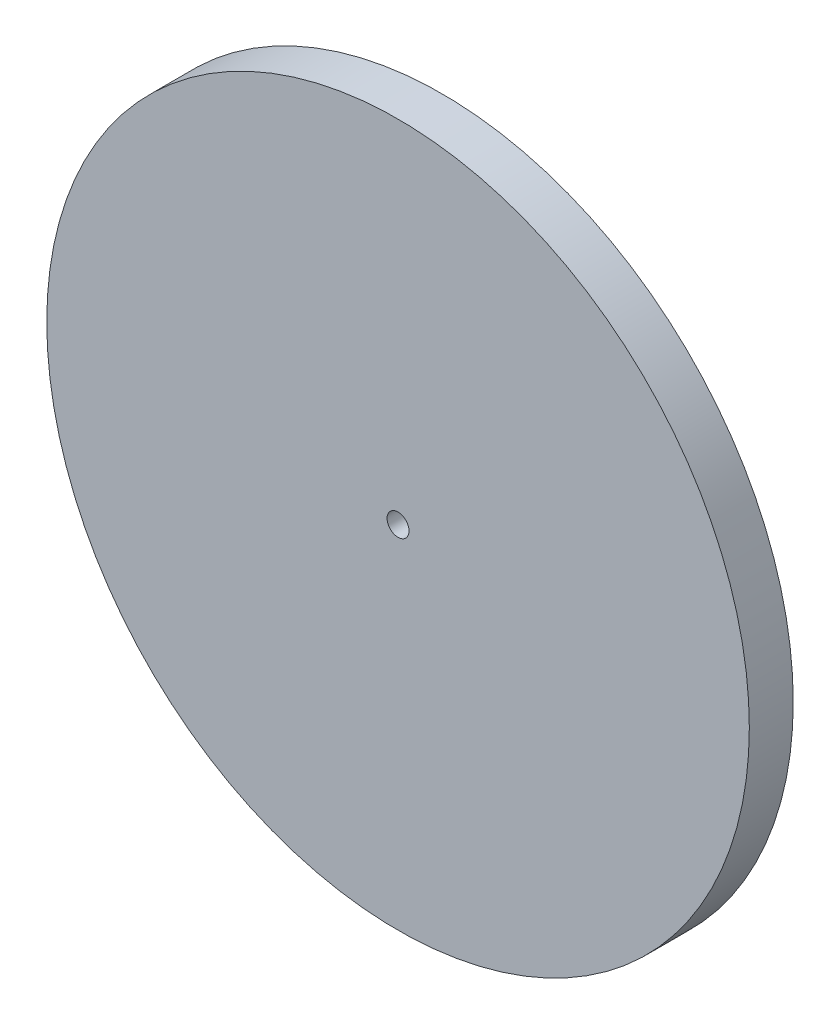
ISO-10303-21;
HEADER;
FILE_DESCRIPTION(('STEP AP214'),'2;1');
FILE_NAME('part.step','',(''),(''),'','','');
FILE_SCHEMA(('AUTOMOTIVE_DESIGN { 1 0 10303 214 1 1 1 1 }'));
ENDSEC;
DATA;
#1=APPLICATION_CONTEXT('core data for automotive mechanical design processes');
#2=APPLICATION_PROTOCOL_DEFINITION('international standard','automotive_design',2000,#1);
#3=PRODUCT_CONTEXT('',#1,'mechanical');
#4=PRODUCT('Part','Part','',(#3));
#5=PRODUCT_RELATED_PRODUCT_CATEGORY('part','',(#4));
#6=PRODUCT_DEFINITION_FORMATION('','',#4);
#7=PRODUCT_DEFINITION_CONTEXT('part definition',#1,'design');
#8=PRODUCT_DEFINITION('design','',#6,#7);
#9=PRODUCT_DEFINITION_SHAPE('','',#8);
#10=(LENGTH_UNIT() NAMED_UNIT(*) SI_UNIT(.MILLI.,.METRE.));
#11=(NAMED_UNIT(*) PLANE_ANGLE_UNIT() SI_UNIT($,.RADIAN.));
#12=(NAMED_UNIT(*) SI_UNIT($,.STERADIAN.) SOLID_ANGLE_UNIT());
#13=UNCERTAINTY_MEASURE_WITH_UNIT(LENGTH_MEASURE(1.E-05),#10,'distance_accuracy_value','');
#14=(GEOMETRIC_REPRESENTATION_CONTEXT(3) GLOBAL_UNCERTAINTY_ASSIGNED_CONTEXT((#13)) GLOBAL_UNIT_ASSIGNED_CONTEXT((#10,
#11,#12)) REPRESENTATION_CONTEXT('',''));
#15=CARTESIAN_POINT('',(0.,0.,0.));
#16=DIRECTION('',(0.,0.,1.));
#17=DIRECTION('',(1.,0.,0.));
#18=AXIS2_PLACEMENT_3D('',#15,#16,#17);
#19=CARTESIAN_POINT('',(0.,0.,10.));
#20=DIRECTION('',(0.,0.,-1.));
#21=DIRECTION('',(-1.,0.,0.));
#22=AXIS2_PLACEMENT_3D('',#19,#20,#21);
#23=CYLINDRICAL_SURFACE('',#22,160.);
#24=CARTESIAN_POINT('',(0.,0.,10.));
#25=DIRECTION('',(0.,0.,1.));
#26=DIRECTION('',(1.,0.,0.));
#27=AXIS2_PLACEMENT_3D('',#24,#25,#26);
#28=CIRCLE('',#27,160.);
#29=CARTESIAN_POINT('',(160.,0.,10.));
#30=VERTEX_POINT('',#29);
#31=EDGE_CURVE('E11',#30,#30,#28,.T.);
#32=ORIENTED_EDGE('',*,*,#31,.F.);
#33=EDGE_LOOP('',(#32));
#34=FACE_BOUND('',#33,.T.);
#35=CARTESIAN_POINT('',(0.,0.,-10.));
#36=DIRECTION('',(0.,0.,-1.));
#37=DIRECTION('',(-1.,0.,0.));
#38=AXIS2_PLACEMENT_3D('',#35,#36,#37);
#39=CIRCLE('',#38,160.);
#40=CARTESIAN_POINT('',(-160.,0.,-10.));
#41=VERTEX_POINT('',#40);
#42=EDGE_CURVE('E47',#41,#41,#39,.T.);
#43=ORIENTED_EDGE('',*,*,#42,.F.);
#44=EDGE_LOOP('',(#43));
#45=FACE_BOUND('',#44,.T.);
#46=ADVANCED_FACE('F40',(#34,#45),#23,.T.);
#47=CARTESIAN_POINT('',(0.,0.,10.));
#48=DIRECTION('',(0.,0.,1.));
#49=DIRECTION('',(1.,0.,0.));
#50=AXIS2_PLACEMENT_3D('',#47,#48,#49);
#51=PLANE('',#50);
#52=CARTESIAN_POINT('',(0.,0.,10.));
#53=DIRECTION('',(0.,0.,1.));
#54=DIRECTION('',(1.,0.,0.));
#55=AXIS2_PLACEMENT_3D('',#52,#53,#54);
#56=CIRCLE('',#55,5.);
#57=CARTESIAN_POINT('',(5.,0.,10.));
#58=VERTEX_POINT('',#57);
#59=EDGE_CURVE('E59',#58,#58,#56,.T.);
#60=ORIENTED_EDGE('',*,*,#59,.F.);
#61=EDGE_LOOP('',(#60));
#62=FACE_BOUND('',#61,.T.);
#63=ORIENTED_EDGE('',*,*,#31,.T.);
#64=EDGE_LOOP('',(#63));
#65=FACE_BOUND('',#64,.T.);
#66=ADVANCED_FACE('F78',(#62,#65),#51,.T.);
#67=CARTESIAN_POINT('',(0.,0.,-10.));
#68=DIRECTION('',(0.,0.,-1.));
#69=DIRECTION('',(-1.,0.,0.));
#70=AXIS2_PLACEMENT_3D('',#67,#68,#69);
#71=PLANE('',#70);
#72=ORIENTED_EDGE('',*,*,#42,.T.);
#73=EDGE_LOOP('',(#72));
#74=FACE_BOUND('',#73,.T.);
#75=CARTESIAN_POINT('',(0.,0.,-10.));
#76=DIRECTION('',(0.,0.,-1.));
#77=DIRECTION('',(-1.,0.,0.));
#78=AXIS2_PLACEMENT_3D('',#75,#76,#77);
#79=CIRCLE('',#78,155.);
#80=CARTESIAN_POINT('',(-155.,0.,-10.));
#81=VERTEX_POINT('',#80);
#82=EDGE_CURVE('E51',#81,#81,#79,.T.);
#83=ORIENTED_EDGE('',*,*,#82,.F.);
#84=EDGE_LOOP('',(#83));
#85=FACE_BOUND('',#84,.T.);
#86=ADVANCED_FACE('F83',(#74,#85),#71,.T.);
#87=CARTESIAN_POINT('',(0.,0.,-10.));
#88=DIRECTION('',(0.,0.,1.));
#89=DIRECTION('',(1.,0.,0.));
#90=AXIS2_PLACEMENT_3D('',#87,#88,#89);
#91=CYLINDRICAL_SURFACE('',#90,155.);
#92=ORIENTED_EDGE('',*,*,#82,.T.);
#93=EDGE_LOOP('',(#92));
#94=FACE_BOUND('',#93,.T.);
#95=CARTESIAN_POINT('',(0.,0.,0.));
#96=DIRECTION('',(0.,0.,-1.));
#97=DIRECTION('',(-1.,0.,0.));
#98=AXIS2_PLACEMENT_3D('',#95,#96,#97);
#99=CIRCLE('',#98,155.);
#100=CARTESIAN_POINT('',(-155.,0.,0.));
#101=VERTEX_POINT('',#100);
#102=EDGE_CURVE('E54',#101,#101,#99,.T.);
#103=ORIENTED_EDGE('',*,*,#102,.F.);
#104=EDGE_LOOP('',(#103));
#105=FACE_BOUND('',#104,.T.);
#106=ADVANCED_FACE('F75',(#94,#105),#91,.F.);
#107=CARTESIAN_POINT('',(0.,0.,0.));
#108=DIRECTION('',(0.,0.,1.));
#109=DIRECTION('',(1.,0.,0.));
#110=AXIS2_PLACEMENT_3D('',#107,#108,#109);
#111=PLANE('',#110);
#112=CARTESIAN_POINT('',(0.,0.,0.));
#113=DIRECTION('',(0.,0.,1.));
#114=DIRECTION('',(1.,0.,0.));
#115=AXIS2_PLACEMENT_3D('',#112,#113,#114);
#116=CIRCLE('',#115,5.);
#117=CARTESIAN_POINT('',(5.,0.,0.));
#118=VERTEX_POINT('',#117);
#119=EDGE_CURVE('E43',#118,#118,#116,.T.);
#120=ORIENTED_EDGE('',*,*,#119,.T.);
#121=EDGE_LOOP('',(#120));
#122=FACE_BOUND('',#121,.T.);
#123=ORIENTED_EDGE('',*,*,#102,.T.);
#124=EDGE_LOOP('',(#123));
#125=FACE_BOUND('',#124,.T.);
#126=ADVANCED_FACE('F66',(#122,#125),#111,.F.);
#127=CARTESIAN_POINT('',(0.,0.,-10.));
#128=DIRECTION('',(0.,0.,1.));
#129=DIRECTION('',(1.,0.,0.));
#130=AXIS2_PLACEMENT_3D('',#127,#128,#129);
#131=CYLINDRICAL_SURFACE('',#130,5.);
#132=ORIENTED_EDGE('',*,*,#59,.T.);
#133=EDGE_LOOP('',(#132));
#134=FACE_BOUND('',#133,.T.);
#135=ORIENTED_EDGE('',*,*,#119,.F.);
#136=EDGE_LOOP('',(#135));
#137=FACE_BOUND('',#136,.T.);
#138=ADVANCED_FACE('F69',(#134,#137),#131,.F.);
#139=CLOSED_SHELL('',(#46,#66,#86,#106,#126,#138));
#140=MANIFOLD_SOLID_BREP('B2',#139);
#141=ADVANCED_BREP_SHAPE_REPRESENTATION('',(#18,#140),#14);
#142=SHAPE_DEFINITION_REPRESENTATION(#9,#141);
ENDSEC;
END-ISO-10303-21;
